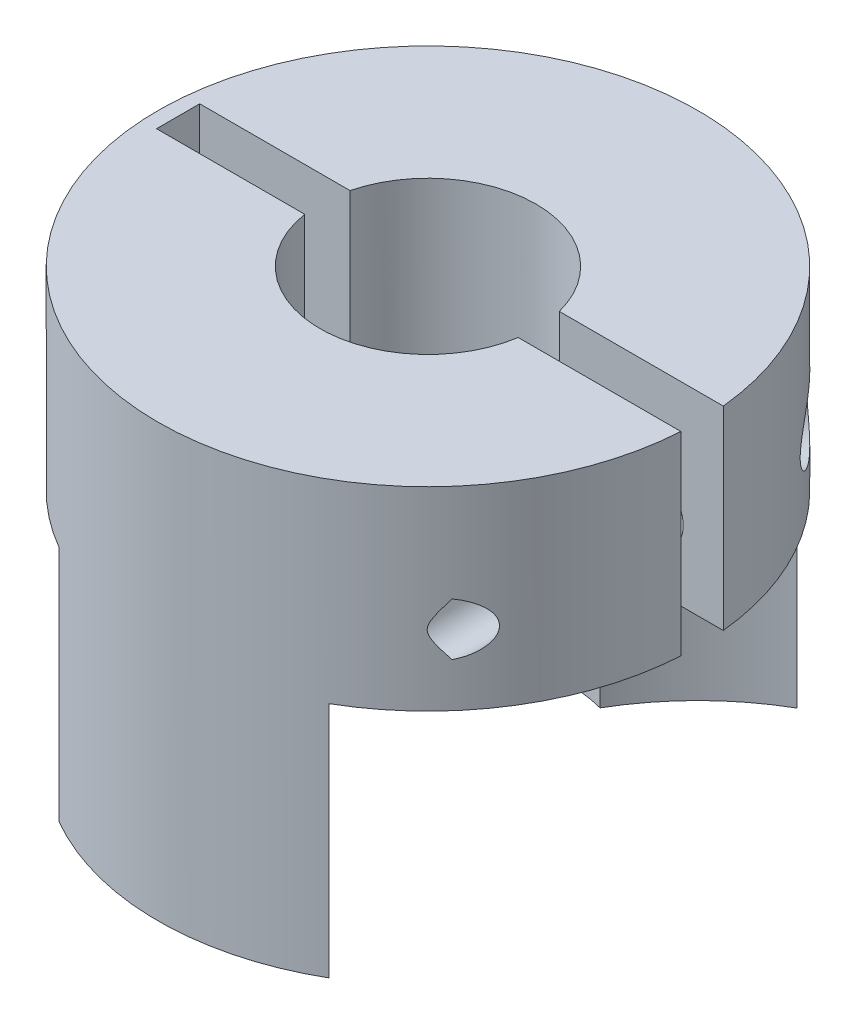
ISO-10303-21;
HEADER;
FILE_DESCRIPTION(('STEP AP214'),'2;1');
FILE_NAME('part.step','',(''),(''),'','','');
FILE_SCHEMA(('AUTOMOTIVE_DESIGN { 1 0 10303 214 1 1 1 1 }'));
ENDSEC;
DATA;
#1=APPLICATION_CONTEXT('core data for automotive mechanical design processes');
#2=APPLICATION_PROTOCOL_DEFINITION('international standard','automotive_design',2000,#1);
#3=PRODUCT_CONTEXT('',#1,'mechanical');
#4=PRODUCT('Part','Part','',(#3));
#5=PRODUCT_RELATED_PRODUCT_CATEGORY('part','',(#4));
#6=PRODUCT_DEFINITION_FORMATION('','',#4);
#7=PRODUCT_DEFINITION_CONTEXT('part definition',#1,'design');
#8=PRODUCT_DEFINITION('design','',#6,#7);
#9=PRODUCT_DEFINITION_SHAPE('','',#8);
#10=(LENGTH_UNIT() NAMED_UNIT(*) SI_UNIT(.MILLI.,.METRE.));
#11=(NAMED_UNIT(*) PLANE_ANGLE_UNIT() SI_UNIT($,.RADIAN.));
#12=(NAMED_UNIT(*) SI_UNIT($,.STERADIAN.) SOLID_ANGLE_UNIT());
#13=UNCERTAINTY_MEASURE_WITH_UNIT(LENGTH_MEASURE(1.E-05),#10,'distance_accuracy_value','');
#14=(GEOMETRIC_REPRESENTATION_CONTEXT(3) GLOBAL_UNCERTAINTY_ASSIGNED_CONTEXT((#13)) GLOBAL_UNIT_ASSIGNED_CONTEXT((#10,
#11,#12)) REPRESENTATION_CONTEXT('',''));
#15=CARTESIAN_POINT('',(0.,0.,0.));
#16=DIRECTION('',(0.,0.,1.));
#17=DIRECTION('',(1.,0.,0.));
#18=AXIS2_PLACEMENT_3D('',#15,#16,#17);
#19=CARTESIAN_POINT('',(9.0873866256993,3.27091239165496,8.26580270830846));
#20=DIRECTION('',(0.,0.,-1.));
#21=DIRECTION('',(-1.,0.,0.));
#22=AXIS2_PLACEMENT_3D('',#19,#20,#21);
#23=CONICAL_SURFACE('',#22,1.25000000001818,1.02974425869486);
#24=CARTESIAN_POINT('',(9.37691343605857,2.05490489736888,8.26580270827864));
#25=CARTESIAN_POINT('',(9.34823636964544,2.10377913839185,8.29833765727385));
#26=CARTESIAN_POINT('',(9.31937379006483,2.15263708601481,8.33073567660937));
#27=CARTESIAN_POINT('',(9.26145900650451,2.25060359496529,8.3950723029447));
#28=CARTESIAN_POINT('',(9.23240668328306,2.29971230857222,8.42701057028863));
#29=CARTESIAN_POINT('',(9.17398462157774,2.39899043619154,8.49057671104065));
#30=CARTESIAN_POINT('',(9.14461528034057,2.44916549976722,8.52219619644441));
#31=CARTESIAN_POINT('',(9.08634435046157,2.55045645984429,8.58429704274558));
#32=CARTESIAN_POINT('',(9.05744259648956,2.60157200951201,8.61477881113187));
#33=CARTESIAN_POINT('',(9.00354761064104,2.70073710212104,8.67107231345171));
#34=CARTESIAN_POINT('',(8.9784419807633,2.74862479685397,8.69705395236432));
#35=CARTESIAN_POINT('',(8.94256452914462,2.82239890995484,8.7338901458976));
#36=CARTESIAN_POINT('',(8.93090353018432,2.84731087232748,8.74581150341275));
#37=CARTESIAN_POINT('',(8.90848505946333,2.89798263721264,8.76864580340958));
#38=CARTESIAN_POINT('',(8.89772721596009,2.92374208475953,8.77955916097537));
#39=CARTESIAN_POINT('',(8.87477187867222,2.98351899911913,8.8027697516426));
#40=CARTESIAN_POINT('',(8.86298277476017,3.01787154664654,8.81463178938376));
#41=CARTESIAN_POINT('',(8.84297662071251,3.0885904327126,8.83470252808923));
#42=CARTESIAN_POINT('',(8.83474366884786,3.12494696915738,8.8429274966196));
#43=CARTESIAN_POINT('',(8.82646544984643,3.17997429994769,8.85118760745881));
#44=CARTESIAN_POINT('',(8.82438832670974,3.19803567567978,8.85325786514942));
#45=CARTESIAN_POINT('',(8.82159655147002,3.23436609213067,8.8560396277983));
#46=CARTESIAN_POINT('',(8.82088162370194,3.25263509008038,8.85675140766933));
#47=CARTESIAN_POINT('',(8.82089059499563,3.30119070653191,8.85674275516931));
#48=CARTESIAN_POINT('',(8.82286746779234,3.33149180944732,8.85477504941482));
#49=CARTESIAN_POINT('',(8.83036615861769,3.39121750209244,8.84729665177245));
#50=CARTESIAN_POINT('',(8.83589671842577,3.42063974260183,8.841777222887));
#51=CARTESIAN_POINT('',(8.84997684207437,3.47974627246575,8.8276844707538));
#52=CARTESIAN_POINT('',(8.85867557033292,3.50935615822802,8.81896003270859));
#53=CARTESIAN_POINT('',(8.87806287003813,3.56723388829251,8.79944254836492));
#54=CARTESIAN_POINT('',(8.88875511147401,3.59549913471964,8.78864568570435));
#55=CARTESIAN_POINT('',(8.91158572947415,3.65127080230195,8.7654953073146));
#56=CARTESIAN_POINT('',(8.92374162950388,3.67876189455889,8.75312279991039));
#57=CARTESIAN_POINT('',(8.94890827634455,3.73283433069144,8.72739164745311));
#58=CARTESIAN_POINT('',(8.96191833341778,3.75941638287051,8.71403379702007));
#59=CARTESIAN_POINT('',(8.99137826196812,3.81760440217316,8.68364300764587));
#60=CARTESIAN_POINT('',(9.00796311503814,3.8490523004461,8.66644045492225));
#61=CARTESIAN_POINT('',(9.04162787703195,3.91127509182417,8.63131272356054));
#62=CARTESIAN_POINT('',(9.05870787571594,3.94204986110761,8.61338741366761));
#63=CARTESIAN_POINT('',(9.11038941308483,4.03374716493374,8.55881467340505));
#64=CARTESIAN_POINT('',(9.14540001417478,4.09398140351941,8.52140386924328));
#65=CARTESIAN_POINT('',(9.21333518724035,4.20983556081705,8.44788756437903));
#66=CARTESIAN_POINT('',(9.24625068273812,4.2655051359255,8.41185056329275));
#67=CARTESIAN_POINT('',(9.31183061237871,4.37641137251642,8.33919771970762));
#68=CARTESIAN_POINT('',(9.34449542356095,4.43164868873858,8.30258321961203));
#69=CARTESIAN_POINT('',(9.37691343606799,4.48691988594578,8.26580270829685));
#70=B_SPLINE_CURVE_WITH_KNOTS('',3,(#24,#25,#26,#27,#28,#29,#30,#31,#32,#33,#34,#35,#36,#37,#38,
#39,#40,#41,#42,#43,#44,#45,#46,#47,#48,#49,#50,#51,#52,#53,#54,#55,#56,#57,#58,#59,#60,#61,#62,
#63,#64,#65,#66,#67,#68,#69),.UNSPECIFIED.,.F.,.F.,(4,2,2,2,2,2,2,2,2,2,2,2,2,2,2,2,2,2,2,2,2,2,
4),(0.,0.19602753707263,0.392193144534779,0.59072440701087,0.78918386679318,0.969036882124861,
1.05894136689586,1.14880866330088,1.26320249647365,1.37707937178137,1.43188093236441,
1.48667140167539,1.5774377040964,1.66842814345155,1.764417363518,1.8605850732717,
1.95804683652526,2.05543084435016,2.1738952739997,2.29238131489985,2.52958422441266,
2.75168786867404,2.97333487639234),.UNSPECIFIED.);
#71=CARTESIAN_POINT('',(9.37691343608817,2.05490489738761,8.26580270827397));
#72=VERTEX_POINT('',#71);
#73=CARTESIAN_POINT('',(9.37691343608786,4.48691988592178,8.26580270827431));
#74=VERTEX_POINT('',#73);
#75=EDGE_CURVE('E23',#72,#74,#70,.T.);
#76=ORIENTED_EDGE('',*,*,#75,.F.);
#77=CARTESIAN_POINT('',(9.0873866256993,3.27091239165496,8.26580270825177));
#78=DIRECTION('',(0.,0.,-1.));
#79=DIRECTION('',(-1.,0.,0.));
#80=AXIS2_PLACEMENT_3D('',#77,#78,#79);
#81=CIRCLE('',#80,1.25);
#82=EDGE_CURVE('E143',#72,#74,#81,.T.);
#83=ORIENTED_EDGE('',*,*,#82,.T.);
#84=EDGE_LOOP('',(#76,#83));
#85=FACE_BOUND('',#84,.T.);
#86=ADVANCED_FACE('F19',(#85),#23,.F.);
#87=CARTESIAN_POINT('',(0.,0.999999999999999,0.));
#88=DIRECTION('',(0.,1.,0.));
#89=DIRECTION('',(0.,0.,1.));
#90=AXIS2_PLACEMENT_3D('',#87,#88,#89);
#91=PLANE('',#90);
#92=DIRECTION('',(1.,0.,0.));
#93=VECTOR('',#92,1.);
#94=CARTESIAN_POINT('',(-11.8043105196322,0.999999999999999,0.765802708251773));
#95=LINE('',#94,#93);
#96=CARTESIAN_POINT('',(-11.8043105196322,0.999999999999999,0.765802708251773));
#97=VERTEX_POINT('',#96);
#98=CARTESIAN_POINT('',(-4.94100659906807,0.999999999999999,0.765802708251773));
#99=VERTEX_POINT('',#98);
#100=EDGE_CURVE('E146',#97,#99,#95,.T.);
#101=ORIENTED_EDGE('',*,*,#100,.T.);
#102=CARTESIAN_POINT('',(0.,0.999999999999999,0.));
#103=DIRECTION('',(0.,-1.,0.));
#104=DIRECTION('',(0.,0.,-1.));
#105=AXIS2_PLACEMENT_3D('',#102,#103,#104);
#106=CIRCLE('',#105,5.);
#107=CARTESIAN_POINT('',(-4.84528193658959,0.999999999999999,-1.23419729174823));
#108=VERTEX_POINT('',#107);
#109=EDGE_CURVE('E362',#99,#108,#106,.T.);
#110=ORIENTED_EDGE('',*,*,#109,.T.);
#111=DIRECTION('',(-1.,0.,0.));
#112=VECTOR('',#111,1.);
#113=CARTESIAN_POINT('',(-3.32475969081981,0.999999999999999,-1.23419729174823));
#114=LINE('',#113,#112);
#115=CARTESIAN_POINT('',(-11.8043105196322,0.999999999999999,-1.23419729174823));
#116=VERTEX_POINT('',#115);
#117=EDGE_CURVE('E241',#108,#116,#114,.T.);
#118=ORIENTED_EDGE('',*,*,#117,.T.);
#119=DIRECTION('',(0.,0.,1.));
#120=VECTOR('',#119,1.);
#121=CARTESIAN_POINT('',(-11.8043105196322,0.999999999999999,-1.23419729174823));
#122=LINE('',#121,#120);
#123=EDGE_CURVE('E232',#116,#97,#122,.T.);
#124=ORIENTED_EDGE('',*,*,#123,.T.);
#125=EDGE_LOOP('',(#101,#110,#118,#124));
#126=FACE_BOUND('',#125,.T.);
#127=ADVANCED_FACE('F218',(#126),#91,.T.);
#128=CARTESIAN_POINT('',(9.0873866256993,3.27091239165496,0.765802708251773));
#129=DIRECTION('',(0.,0.,-1.));
#130=DIRECTION('',(-1.,0.,0.));
#131=AXIS2_PLACEMENT_3D('',#128,#129,#130);
#132=CYLINDRICAL_SURFACE('',#131,1.25);
#133=CARTESIAN_POINT('',(9.0873866256993,3.27091239165496,0.765802708251773));
#134=DIRECTION('',(0.,0.,-1.));
#135=DIRECTION('',(-1.,0.,0.));
#136=AXIS2_PLACEMENT_3D('',#133,#134,#135);
#137=CIRCLE('',#136,1.25);
#138=CARTESIAN_POINT('',(7.8373866256993,3.27091239165496,0.765802708251773));
#139=VERTEX_POINT('',#138);
#140=EDGE_CURVE('E354',#139,#139,#137,.T.);
#141=ORIENTED_EDGE('',*,*,#140,.T.);
#142=EDGE_LOOP('',(#141));
#143=FACE_BOUND('',#142,.T.);
#144=CARTESIAN_POINT('',(9.37691343610224,4.48691988589909,8.265802708258));
#145=CARTESIAN_POINT('',(9.42635211766137,4.47512071704447,8.20972797600935));
#146=CARTESIAN_POINT('',(9.47497923156122,4.46038262060935,8.1535407076429));
#147=CARTESIAN_POINT('',(9.57042977419815,4.42494242517149,8.04128549213383));
#148=CARTESIAN_POINT('',(9.61724884594837,4.40422682872897,7.98521810760817));
#149=CARTESIAN_POINT('',(9.70919960881088,4.35652663614726,7.87316740356659));
#150=CARTESIAN_POINT('',(9.7543057733657,4.32947283321155,7.81719243087551));
#151=CARTESIAN_POINT('',(9.84183287731895,4.26898035623884,7.70670366523164));
#152=CARTESIAN_POINT('',(9.88425681548962,4.23554898671687,7.65218828122307));
#153=CARTESIAN_POINT('',(9.9670636216485,4.16078164336086,7.54403098772386));
#154=CARTESIAN_POINT('',(10.0073602963814,4.11925639531322,7.49045254240309));
#155=CARTESIAN_POINT('',(10.083684943877,4.02815291750281,7.38738000353898));
#156=CARTESIAN_POINT('',(10.1197235480285,3.97859550959755,7.33787583557525));
#157=CARTESIAN_POINT('',(10.1784621073682,3.88282606204299,7.25608955181111));
#158=CARTESIAN_POINT('',(10.2023205996824,3.83848351710648,7.22247011074012));
#159=CARTESIAN_POINT('',(10.2455821366241,3.74395761270726,7.16096736805215));
#160=CARTESIAN_POINT('',(10.2649922832987,3.69378375907839,7.13307493045183));
#161=CARTESIAN_POINT('',(10.2932897849698,3.60244101476354,7.09215256357241));
#162=CARTESIAN_POINT('',(10.3036028579756,3.56260733902115,7.07714527479881));
#163=CARTESIAN_POINT('',(10.3203901095135,3.48053854465573,7.05264290959657));
#164=CARTESIAN_POINT('',(10.3268741502231,3.43830990514017,7.04313367354294));
#165=CARTESIAN_POINT('',(10.333227157052,3.37488587308372,7.03380609880895));
#166=CARTESIAN_POINT('',(10.3347825481541,3.35419382855318,7.03151999048695));
#167=CARTESIAN_POINT('',(10.3368631741153,3.31264241161596,7.02846091769711));
#168=CARTESIAN_POINT('',(10.3373881959266,3.29178300549926,7.0276882661644));
#169=CARTESIAN_POINT('',(10.3373834612683,3.22885248262355,7.02769585710759));
#170=CARTESIAN_POINT('',(10.3352416429691,3.18674705552835,7.03084913282139));
#171=CARTESIAN_POINT('',(10.3268727273246,3.10381253987385,7.04313501285828));
#172=CARTESIAN_POINT('',(10.320637743538,3.06298607495619,7.05227915992845));
#173=CARTESIAN_POINT('',(10.3027386674938,2.97442886047198,7.07840924045334));
#174=CARTESIAN_POINT('',(10.2901537464402,2.92727899631073,7.09671784790626));
#175=CARTESIAN_POINT('',(10.2606964174355,2.83720510109077,7.13924216690707));
#176=CARTESIAN_POINT('',(10.2438168989196,2.79428824376109,7.16346767237377));
#177=CARTESIAN_POINT('',(10.1972048894908,2.69176515500364,7.22975599655687));
#178=CARTESIAN_POINT('',(10.1653291973777,2.63494171793569,7.27458106309522));
#179=CARTESIAN_POINT('',(10.0962539806625,2.53021157642081,7.37015339172015));
#180=CARTESIAN_POINT('',(10.0590401505951,2.48232965422342,7.42091649721168));
#181=CARTESIAN_POINT('',(9.98818383602695,2.40297464708103,7.51591604457926));
#182=CARTESIAN_POINT('',(9.95523140298635,2.37011690945146,7.55952955719941));
#183=CARTESIAN_POINT('',(9.88714518603896,2.30915610007333,7.6483661327337));
#184=CARTESIAN_POINT('',(9.8520099738852,2.28105618724709,7.6935902410651));
#185=CARTESIAN_POINT('',(9.74380555650733,2.20343499031652,7.83082057760833));
#186=CARTESIAN_POINT('',(9.66789616186177,2.16054769618412,7.92444073776088));
#187=CARTESIAN_POINT('',(9.55475796989306,2.11096847021031,8.05974659889356));
#188=CARTESIAN_POINT('',(9.51979073508178,2.09748676243211,8.10102206760082));
#189=CARTESIAN_POINT('',(9.44900316802141,2.07378297086981,8.18347540666459));
#190=CARTESIAN_POINT('',(9.4131868374943,2.0635479813073,8.22465300085292));
#191=CARTESIAN_POINT('',(9.3769134361023,2.05490489741057,8.26580270825795));
#192=B_SPLINE_CURVE_WITH_KNOTS('',3,(#144,#145,#146,#147,#148,#149,#150,#151,#152,#153,#154,
#155,#156,#157,#158,#159,#160,#161,#162,#163,#164,#165,#166,#167,#168,#169,#170,#171,#172,#173,
#174,#175,#176,#177,#178,#179,#180,#181,#182,#183,#184,#185,#186,#187,#188,#189,#190,#191),
.UNSPECIFIED.,.F.,.F.,(4,2,2,2,2,2,2,2,2,2,2,2,2,2,2,2,2,2,2,2,2,2,2,4),(0.,0.227001607773341,
0.454519860268775,0.684648796905926,0.914515722016699,1.15059739845029,1.38607658854649,
1.56718608661381,1.74800438636254,1.87893095048438,2.0095188083324,2.07207559165955,
2.13464530839128,2.26074014266351,2.38707864401641,2.54257209338251,2.69832468792664,
2.93426268186902,3.17084519744942,3.36191791656559,3.55311700371936,3.93526999589727,
4.10245218293676,4.26896123863168),.UNSPECIFIED.);
#193=EDGE_CURVE('E141',#74,#72,#192,.T.);
#194=ORIENTED_EDGE('',*,*,#193,.F.);
#195=ORIENTED_EDGE('',*,*,#82,.F.);
#196=EDGE_LOOP('',(#194,#195));
#197=FACE_BOUND('',#196,.T.);
#198=ADVANCED_FACE('F148',(#143,#197),#132,.F.);
#199=CARTESIAN_POINT('',(-11.8043105196322,0.999999999999999,0.765802708251773));
#200=DIRECTION('',(0.,0.,1.));
#201=DIRECTION('',(1.,0.,0.));
#202=AXIS2_PLACEMENT_3D('',#199,#200,#201);
#203=PLANE('',#202);
#204=ORIENTED_EDGE('',*,*,#100,.F.);
#205=DIRECTION('',(0.,1.,0.));
#206=VECTOR('',#205,1.);
#207=CARTESIAN_POINT('',(-11.8043105196322,0.999999999999999,0.765802708251773));
#208=LINE('',#207,#206);
#209=CARTESIAN_POINT('',(-11.8043105196322,9.,0.765802708251773));
#210=VERTEX_POINT('',#209);
#211=EDGE_CURVE('E224',#97,#210,#208,.T.);
#212=ORIENTED_EDGE('',*,*,#211,.T.);
#213=DIRECTION('',(1.,0.,0.));
#214=VECTOR('',#213,1.);
#215=CARTESIAN_POINT('',(0.,9.,0.765802708251773));
#216=LINE('',#215,#214);
#217=CARTESIAN_POINT('',(-4.94100659906807,9.,0.765802708251773));
#218=VERTEX_POINT('',#217);
#219=EDGE_CURVE('E357',#218,#210,#216,.F.);
#220=ORIENTED_EDGE('',*,*,#219,.F.);
#221=DIRECTION('',(0.,-1.,0.));
#222=VECTOR('',#221,1.);
#223=CARTESIAN_POINT('',(-4.94100659906807,9.,0.765802708251773));
#224=LINE('',#223,#222);
#225=EDGE_CURVE('E227',#218,#99,#224,.T.);
#226=ORIENTED_EDGE('',*,*,#225,.T.);
#227=EDGE_LOOP('',(#204,#212,#220,#226));
#228=FACE_BOUND('',#227,.T.);
#229=ADVANCED_FACE('F211',(#228),#203,.F.);
#230=CARTESIAN_POINT('',(-11.8043105196322,0.999999999999999,-1.23419729174823));
#231=DIRECTION('',(-1.,0.,0.));
#232=DIRECTION('',(0.,0.,1.));
#233=AXIS2_PLACEMENT_3D('',#230,#231,#232);
#234=PLANE('',#233);
#235=ORIENTED_EDGE('',*,*,#211,.F.);
#236=ORIENTED_EDGE('',*,*,#123,.F.);
#237=DIRECTION('',(0.,1.,0.));
#238=VECTOR('',#237,1.);
#239=CARTESIAN_POINT('',(-11.8043105196322,0.999999999999999,-1.23419729174823));
#240=LINE('',#239,#238);
#241=CARTESIAN_POINT('',(-11.8043105196322,9.,-1.23419729174823));
#242=VERTEX_POINT('',#241);
#243=EDGE_CURVE('E246',#116,#242,#240,.T.);
#244=ORIENTED_EDGE('',*,*,#243,.T.);
#245=DIRECTION('',(0.,0.,1.));
#246=VECTOR('',#245,1.);
#247=CARTESIAN_POINT('',(-11.8043105196322,9.,0.));
#248=LINE('',#247,#246);
#249=EDGE_CURVE('E238',#210,#242,#248,.F.);
#250=ORIENTED_EDGE('',*,*,#249,.F.);
#251=EDGE_LOOP('',(#235,#236,#244,#250));
#252=FACE_BOUND('',#251,.T.);
#253=ADVANCED_FACE('F208',(#252),#234,.F.);
#254=CARTESIAN_POINT('',(-3.32475969081981,0.999999999999999,-1.23419729174823));
#255=DIRECTION('',(0.,0.,-1.));
#256=DIRECTION('',(-1.,0.,0.));
#257=AXIS2_PLACEMENT_3D('',#254,#255,#256);
#258=PLANE('',#257);
#259=DIRECTION('',(1.,0.,0.));
#260=VECTOR('',#259,1.);
#261=CARTESIAN_POINT('',(0.,9.,-1.23419729174823));
#262=LINE('',#261,#260);
#263=CARTESIAN_POINT('',(-4.84528193658959,9.,-1.23419729174823));
#264=VERTEX_POINT('',#263);
#265=EDGE_CURVE('E371',#242,#264,#262,.T.);
#266=ORIENTED_EDGE('',*,*,#265,.F.);
#267=ORIENTED_EDGE('',*,*,#243,.F.);
#268=ORIENTED_EDGE('',*,*,#117,.F.);
#269=DIRECTION('',(0.,-1.,0.));
#270=VECTOR('',#269,1.);
#271=CARTESIAN_POINT('',(-4.84528193658959,9.,-1.23419729174823));
#272=LINE('',#271,#270);
#273=EDGE_CURVE('E363',#108,#264,#272,.F.);
#274=ORIENTED_EDGE('',*,*,#273,.T.);
#275=EDGE_LOOP('',(#266,#267,#268,#274));
#276=FACE_BOUND('',#275,.T.);
#277=ADVANCED_FACE('F203',(#276),#258,.F.);
#278=CARTESIAN_POINT('',(9.08341624904097,3.2825117784796,-11.));
#279=DIRECTION('',(0.,0.,1.));
#280=DIRECTION('',(1.,0.,0.));
#281=AXIS2_PLACEMENT_3D('',#278,#279,#280);
#282=CYLINDRICAL_SURFACE('',#281,1.5);
#283=CARTESIAN_POINT('',(9.08341624904097,3.2825117784796,-1.23419729174823));
#284=DIRECTION('',(0.,0.,1.));
#285=DIRECTION('',(1.,0.,0.));
#286=AXIS2_PLACEMENT_3D('',#283,#284,#285);
#287=CIRCLE('',#286,1.5);
#288=CARTESIAN_POINT('',(10.583416249041,3.2825117784796,-1.23419729174823));
#289=VERTEX_POINT('',#288);
#290=EDGE_CURVE('E349',#289,#289,#287,.T.);
#291=ORIENTED_EDGE('',*,*,#290,.T.);
#292=EDGE_LOOP('',(#291));
#293=FACE_BOUND('',#292,.T.);
#294=CARTESIAN_POINT('',(7.58341624904096,3.2825117784796,-9.936890760886));
#295=CARTESIAN_POINT('',(7.5834209983723,3.21143745133633,-9.93688791578893));
#296=CARTESIAN_POINT('',(7.58850330023537,3.14029955579842,-9.933014902131));
#297=CARTESIAN_POINT('',(7.60851615660126,3.00021188265577,-9.91769288383972));
#298=CARTESIAN_POINT('',(7.62346062306707,2.9312653404797,-9.90623317704108));
#299=CARTESIAN_POINT('',(7.66218339506182,2.79784373522121,-9.87631183146526));
#300=CARTESIAN_POINT('',(7.68592572763091,2.73335171505184,-9.85787869948852));
#301=CARTESIAN_POINT('',(7.74093401058121,2.60997250290294,-9.81474183306818));
#302=CARTESIAN_POINT('',(7.77219977970482,2.55108517594063,-9.79003824969398));
#303=CARTESIAN_POINT('',(7.84283812936195,2.43648492336443,-9.73355252599749));
#304=CARTESIAN_POINT('',(7.88258117882353,2.3811665799132,-9.70143779820937));
#305=CARTESIAN_POINT('',(7.96720279283359,2.27826359565636,-9.63206545559696));
#306=CARTESIAN_POINT('',(8.01208410240839,2.23068312183544,-9.59480508959177));
#307=CARTESIAN_POINT('',(8.12803827065346,2.12223910452323,-9.497006711656));
#308=CARTESIAN_POINT('',(8.20131124737801,2.06602186903032,-9.43390328109512));
#309=CARTESIAN_POINT('',(8.35207102013524,1.96981634606421,-9.30070468959651));
#310=CARTESIAN_POINT('',(8.42956687483015,1.92986463990707,-9.23059420563224));
#311=CARTESIAN_POINT('',(8.61254699709539,1.85382196597489,-9.06059550866597));
#312=CARTESIAN_POINT('',(8.71859898789944,1.82364926863922,-8.95868026574796));
#313=CARTESIAN_POINT('',(8.92889036520317,1.78666910321221,-8.74911800772141));
#314=CARTESIAN_POINT('',(9.03312830513469,1.77987950182748,-8.64146667348855));
#315=CARTESIAN_POINT('',(9.23976660787357,1.7870184874968,-8.42022507384299));
#316=CARTESIAN_POINT('',(9.34205954980291,1.80145823446578,-8.30655393851707));
#317=CARTESIAN_POINT('',(9.54047540872224,1.85018755505512,-8.0778860434292));
#318=CARTESIAN_POINT('',(9.63659273291734,1.88449484739089,-7.96288819028606));
#319=CARTESIAN_POINT('',(9.77570791829862,1.95081291897803,-7.79045215428129));
#320=CARTESIAN_POINT('',(9.82159559527422,1.97566541170884,-7.73250250591096));
#321=CARTESIAN_POINT('',(9.91117603914184,2.03048444366458,-7.6173419113347));
#322=CARTESIAN_POINT('',(9.95486961946798,2.06044906923913,-7.56013069729581));
#323=CARTESIAN_POINT('',(10.0397434101869,2.12566332208265,-7.44704924449809));
#324=CARTESIAN_POINT('',(10.0809279785422,2.16090339541066,-7.39117678917208));
#325=CARTESIAN_POINT('',(10.160499810509,2.23708200250361,-7.28140311598012));
#326=CARTESIAN_POINT('',(10.1988891090759,2.27801632637213,-7.22750047862018));
#327=CARTESIAN_POINT('',(10.2728464639377,2.36674099585688,-7.1219957907564));
#328=CARTESIAN_POINT('',(10.3083735914831,2.41461012802127,-7.07043059667324));
#329=CARTESIAN_POINT('',(10.3752137042791,2.51764115621368,-6.97197719565034));
#330=CARTESIAN_POINT('',(10.4065295982458,2.57279796586568,-6.92508576637646));
#331=CARTESIAN_POINT('',(10.4579800922965,2.67970784988213,-6.84707214862437));
#332=CARTESIAN_POINT('',(10.4791041463771,2.73002536512659,-6.81465827642767));
#333=CARTESIAN_POINT('',(10.5165693905218,2.83616966135234,-6.75669732141226));
#334=CARTESIAN_POINT('',(10.532917861344,2.89198788045397,-6.73113979046078));
#335=CARTESIAN_POINT('',(10.5562086130654,2.99450683549837,-6.69453623048669));
#336=CARTESIAN_POINT('',(10.5644664017396,3.04018409691659,-6.68147999515021));
#337=CARTESIAN_POINT('',(10.5767232244352,3.13343201951037,-6.66206155675668));
#338=CARTESIAN_POINT('',(10.5807356205517,3.18099624822828,-6.65567835153824));
#339=CARTESIAN_POINT('',(10.583096672453,3.24666744110013,-6.65192171301857));
#340=CARTESIAN_POINT('',(10.5834182766484,3.26458434394094,-6.65140989160156));
#341=CARTESIAN_POINT('',(10.5834108043814,3.33065165875324,-6.65142289904988));
#342=CARTESIAN_POINT('',(10.5810717677964,3.37886747929252,-6.6551483866685));
#343=CARTESIAN_POINT('',(10.5719341781345,3.47385077021342,-6.66965327841151));
#344=CARTESIAN_POINT('',(10.5651225933671,3.52061358868959,-6.68045329541552));
#345=CARTESIAN_POINT('',(10.5454716120921,3.62267840069705,-6.711440749881));
#346=CARTESIAN_POINT('',(10.5315646893849,3.67726780843524,-6.73327919141995));
#347=CARTESIAN_POINT('',(10.4990305068669,3.78154725415173,-6.78389749969401));
#348=CARTESIAN_POINT('',(10.4803958062068,3.83122939593955,-6.81268830498432));
#349=CARTESIAN_POINT('',(10.427968305902,3.95234013069076,-6.89281158413716));
#350=CARTESIAN_POINT('',(10.3915512295978,4.02024603153238,-6.94770395071204));
#351=CARTESIAN_POINT('',(10.3125010145991,4.14556359017478,-7.0645128933592));
#352=CARTESIAN_POINT('',(10.2698511200115,4.20294598883921,-7.12644830062381));
#353=CARTESIAN_POINT('',(10.1872258702898,4.29983786888201,-7.24394352711663));
#354=CARTESIAN_POINT('',(10.147962656107,4.34073483979892,-7.29887862566727));
#355=CARTESIAN_POINT('',(10.0666082669755,4.41672283226147,-7.41068025291333));
#356=CARTESIAN_POINT('',(10.0245152982286,4.45181012127855,-7.46754799521294));
#357=CARTESIAN_POINT('',(9.93783796932352,4.51656633648426,-7.58251685589977));
#358=CARTESIAN_POINT('',(9.89325194210634,4.54623157907935,-7.6406187830662));
#359=CARTESIAN_POINT('',(9.80185872325339,4.60033528419106,-7.75751798378818));
#360=CARTESIAN_POINT('',(9.75505065783489,4.62477166938419,-7.8163155239441));
#361=CARTESIAN_POINT('',(9.60678033894445,4.69258755496035,-7.99906903391212));
#362=CARTESIAN_POINT('',(9.50183172474101,4.72723970766937,-8.12356024818867));
#363=CARTESIAN_POINT('',(9.28493656782968,4.77303164926719,-8.37060044994946));
#364=CARTESIAN_POINT('',(9.17299600335341,4.78419124882396,-8.49315098732272));
#365=CARTESIAN_POINT('',(8.96070282622876,4.78069355404172,-8.71642523312947));
#366=CARTESIAN_POINT('',(8.86096454891668,4.76948021029307,-8.81777553595151));
#367=CARTESIAN_POINT('',(8.66051704383935,4.72530822948064,-9.01471400014966));
#368=CARTESIAN_POINT('',(8.55980916272754,4.69237638276791,-9.1103091023809));
#369=CARTESIAN_POINT('',(8.38642041004746,4.61324573878577,-9.26974555640308));
#370=CARTESIAN_POINT('',(8.3130594453231,4.57246487844142,-9.33552730945021));
#371=CARTESIAN_POINT('',(8.17062868114745,4.47590824915122,-9.460430391562));
#372=CARTESIAN_POINT('',(8.10155267174113,4.42015483517101,-9.51956146526428));
#373=CARTESIAN_POINT('',(7.98436369888639,4.30591644918387,-9.6179299005839));
#374=CARTESIAN_POINT('',(7.93483830470483,4.25027099312548,-9.65877097335902));
#375=CARTESIAN_POINT('',(7.84289079923566,4.12919048536879,-9.73357969225019));
#376=CARTESIAN_POINT('',(7.80046921861758,4.06375470300365,-9.76754682490819));
#377=CARTESIAN_POINT('',(7.72486934906234,3.9234187624508,-9.82744903653183));
#378=CARTESIAN_POINT('',(7.69178148408154,3.84843559440766,-9.85330579537247));
#379=CARTESIAN_POINT('',(7.63793806830967,3.69167275217619,-9.89510422431719));
#380=CARTESIAN_POINT('',(7.61714927054076,3.6099120883431,-9.91107263024293));
#381=CARTESIAN_POINT('',(7.59676717538482,3.48632662021488,-9.92669063420421));
#382=CARTESIAN_POINT('',(7.59177336815796,3.44582809263831,-9.930508250563));
#383=CARTESIAN_POINT('',(7.58509658081788,3.36439733028368,-9.93560909980598));
#384=CARTESIAN_POINT('',(7.58341351245611,3.32346510709512,-9.93689240024299));
#385=CARTESIAN_POINT('',(7.58341624904096,3.2825117784796,-9.936890760886));
#386=B_SPLINE_CURVE_WITH_KNOTS('',3,(#294,#295,#296,#297,#298,#299,#300,#301,#302,#303,#304,
#305,#306,#307,#308,#309,#310,#311,#312,#313,#314,#315,#316,#317,#318,#319,#320,#321,#322,#323,
#324,#325,#326,#327,#328,#329,#330,#331,#332,#333,#334,#335,#336,#337,#338,#339,#340,#341,#342,
#343,#344,#345,#346,#347,#348,#349,#350,#351,#352,#353,#354,#355,#356,#357,#358,#359,#360,#361,
#362,#363,#364,#365,#366,#367,#368,#369,#370,#371,#372,#373,#374,#375,#376,#377,#378,#379,#380,
#381,#382,#383,#384,#385),.UNSPECIFIED.,.T.,.F.,(4,2,2,2,2,2,2,2,2,2,2,2,2,2,2,2,2,2,2,2,2,2,2,
2,2,2,2,2,2,2,2,2,2,2,2,2,2,2,2,2,2,2,2,2,2,4),(0.,0.2130544743075,0.426410136043908,
0.638902879937481,0.851390504884473,1.07646323317594,1.30165676875022,1.635356685488,
1.96980300468222,2.41782305252272,2.86618535055018,3.32552163760485,3.78526821241258,
4.0190591047744,4.25276267227333,4.48604800667702,4.71916177532404,4.95516878664214,
5.19101194038896,5.38084029179763,5.57037770590489,5.71446325485677,5.85809394254616,
5.91185465621843,6.05621632235796,6.20100049369756,6.38123406762707,6.56175308253496,
6.84400054552353,7.12702123928809,7.36353525376719,7.60020063598683,7.8370262095117,
8.07394569526736,8.57145448698937,9.06854357396416,9.49498073424352,9.9208928543554,
10.2397125566259,10.5580588623553,10.8119383179371,11.0658367303861,11.3221164429486,
11.5777001738261,11.7004663375608,11.8232292288891),.UNSPECIFIED.);
#387=CARTESIAN_POINT('',(7.58341624904096,3.2825117784796,-9.936890760886));
#388=VERTEX_POINT('',#387);
#389=EDGE_CURVE('E185',#388,#388,#386,.T.);
#390=ORIENTED_EDGE('',*,*,#389,.F.);
#391=EDGE_LOOP('',(#390));
#392=FACE_BOUND('',#391,.T.);
#393=ADVANCED_FACE('F197',(#293,#392),#282,.F.);
#394=CARTESIAN_POINT('',(4.12809385323243,0.,0.765802708251773));
#395=DIRECTION('',(0.,0.,1.));
#396=DIRECTION('',(1.,0.,0.));
#397=AXIS2_PLACEMENT_3D('',#394,#395,#396);
#398=PLANE('',#397);
#399=DIRECTION('',(0.,-1.,0.));
#400=VECTOR('',#399,1.);
#401=CARTESIAN_POINT('',(4.94100659906807,9.,0.765802708251773));
#402=LINE('',#401,#400);
#403=CARTESIAN_POINT('',(4.94100659906807,0.,0.765802708251773));
#404=VERTEX_POINT('',#403);
#405=CARTESIAN_POINT('',(4.94100659906807,9.,0.765802708251773));
#406=VERTEX_POINT('',#405);
#407=EDGE_CURVE('E350',#404,#406,#402,.F.);
#408=ORIENTED_EDGE('',*,*,#407,.T.);
#409=DIRECTION('',(1.,0.,0.));
#410=VECTOR('',#409,1.);
#411=CARTESIAN_POINT('',(0.,9.,0.765802708251773));
#412=LINE('',#411,#410);
#413=CARTESIAN_POINT('',(12.4765197956816,9.,0.765802708251773));
#414=VERTEX_POINT('',#413);
#415=EDGE_CURVE('E412',#414,#406,#412,.F.);
#416=ORIENTED_EDGE('',*,*,#415,.F.);
#417=DIRECTION('',(0.,-1.,0.));
#418=VECTOR('',#417,1.);
#419=CARTESIAN_POINT('',(12.4765197956816,9.,0.765802708251774));
#420=LINE('',#419,#418);
#421=CARTESIAN_POINT('',(12.4765197956816,0.,0.765802708251773));
#422=VERTEX_POINT('',#421);
#423=EDGE_CURVE('E158',#422,#414,#420,.F.);
#424=ORIENTED_EDGE('',*,*,#423,.F.);
#425=DIRECTION('',(1.,0.,0.));
#426=VECTOR('',#425,1.);
#427=CARTESIAN_POINT('',(0.,0.,0.765802708251773));
#428=LINE('',#427,#426);
#429=EDGE_CURVE('E301',#422,#404,#428,.F.);
#430=ORIENTED_EDGE('',*,*,#429,.T.);
#431=EDGE_LOOP('',(#408,#416,#424,#430));
#432=FACE_BOUND('',#431,.T.);
#433=ORIENTED_EDGE('',*,*,#140,.F.);
#434=EDGE_LOOP('',(#433));
#435=FACE_BOUND('',#434,.T.);
#436=ADVANCED_FACE('F202',(#432,#435),#398,.F.);
#437=CARTESIAN_POINT('',(0.,9.,0.));
#438=DIRECTION('',(0.,-1.,0.));
#439=DIRECTION('',(0.,0.,-1.));
#440=AXIS2_PLACEMENT_3D('',#437,#438,#439);
#441=CYLINDRICAL_SURFACE('',#440,5.);
#442=CARTESIAN_POINT('',(0.,9.,0.));
#443=DIRECTION('',(0.,-1.,0.));
#444=DIRECTION('',(0.,0.,-1.));
#445=AXIS2_PLACEMENT_3D('',#442,#443,#444);
#446=CIRCLE('',#445,5.);
#447=CARTESIAN_POINT('',(4.84528193658959,9.,-1.23419729174823));
#448=VERTEX_POINT('',#447);
#449=EDGE_CURVE('E171',#264,#448,#446,.T.);
#450=ORIENTED_EDGE('',*,*,#449,.F.);
#451=ORIENTED_EDGE('',*,*,#273,.F.);
#452=ORIENTED_EDGE('',*,*,#109,.F.);
#453=ORIENTED_EDGE('',*,*,#225,.F.);
#454=CARTESIAN_POINT('',(0.,9.,0.));
#455=DIRECTION('',(0.,-1.,0.));
#456=DIRECTION('',(0.,0.,-1.));
#457=AXIS2_PLACEMENT_3D('',#454,#455,#456);
#458=CIRCLE('',#457,5.);
#459=EDGE_CURVE('E196',#406,#218,#458,.T.);
#460=ORIENTED_EDGE('',*,*,#459,.F.);
#461=ORIENTED_EDGE('',*,*,#407,.F.);
#462=CARTESIAN_POINT('',(0.,0.,0.));
#463=DIRECTION('',(0.,-1.,0.));
#464=DIRECTION('',(0.,0.,-1.));
#465=AXIS2_PLACEMENT_3D('',#462,#463,#464);
#466=CIRCLE('',#465,5.);
#467=CARTESIAN_POINT('',(4.84528193658959,0.,-1.23419729174823));
#468=VERTEX_POINT('',#467);
#469=EDGE_CURVE('E298',#404,#468,#466,.T.);
#470=ORIENTED_EDGE('',*,*,#469,.T.);
#471=DIRECTION('',(0.,1.,0.));
#472=VECTOR('',#471,1.);
#473=CARTESIAN_POINT('',(4.84528193658959,0.,-1.23419729174823));
#474=LINE('',#473,#472);
#475=EDGE_CURVE('E346',#468,#448,#474,.T.);
#476=ORIENTED_EDGE('',*,*,#475,.T.);
#477=EDGE_LOOP('',(#450,#451,#452,#453,#460,#461,#470,#476));
#478=FACE_BOUND('',#477,.T.);
#479=ADVANCED_FACE('F426',(#478),#441,.F.);
#480=CARTESIAN_POINT('',(4.12809385323243,0.,-1.23419729174823));
#481=DIRECTION('',(0.,0.,-1.));
#482=DIRECTION('',(-1.,0.,0.));
#483=AXIS2_PLACEMENT_3D('',#480,#481,#482);
#484=PLANE('',#483);
#485=ORIENTED_EDGE('',*,*,#475,.F.);
#486=DIRECTION('',(1.,0.,0.));
#487=VECTOR('',#486,1.);
#488=CARTESIAN_POINT('',(0.,0.,-1.23419729174823));
#489=LINE('',#488,#487);
#490=CARTESIAN_POINT('',(12.4389210563071,0.,-1.23419729174823));
#491=VERTEX_POINT('',#490);
#492=EDGE_CURVE('E297',#468,#491,#489,.T.);
#493=ORIENTED_EDGE('',*,*,#492,.T.);
#494=DIRECTION('',(0.,-1.,0.));
#495=VECTOR('',#494,1.);
#496=CARTESIAN_POINT('',(12.4389210563071,9.,-1.23419729174823));
#497=LINE('',#496,#495);
#498=CARTESIAN_POINT('',(12.4389210563071,9.,-1.23419729174823));
#499=VERTEX_POINT('',#498);
#500=EDGE_CURVE('E340',#499,#491,#497,.T.);
#501=ORIENTED_EDGE('',*,*,#500,.F.);
#502=DIRECTION('',(1.,0.,0.));
#503=VECTOR('',#502,1.);
#504=CARTESIAN_POINT('',(0.,9.,-1.23419729174823));
#505=LINE('',#504,#503);
#506=EDGE_CURVE('E415',#448,#499,#505,.T.);
#507=ORIENTED_EDGE('',*,*,#506,.F.);
#508=EDGE_LOOP('',(#485,#493,#501,#507));
#509=FACE_BOUND('',#508,.T.);
#510=ORIENTED_EDGE('',*,*,#290,.F.);
#511=EDGE_LOOP('',(#510));
#512=FACE_BOUND('',#511,.T.);
#513=ADVANCED_FACE('F440',(#509,#512),#484,.F.);
#514=CARTESIAN_POINT('',(12.5,0.,0.));
#515=DIRECTION('',(0.,-1.,0.));
#516=DIRECTION('',(0.,0.,-1.));
#517=AXIS2_PLACEMENT_3D('',#514,#515,#516);
#518=CYLINDRICAL_SURFACE('',#517,12.5);
#519=CARTESIAN_POINT('',(12.5,-11.,0.));
#520=DIRECTION('',(0.,-1.,0.));
#521=DIRECTION('',(0.,0.,-1.));
#522=AXIS2_PLACEMENT_3D('',#519,#520,#521);
#523=CIRCLE('',#522,12.5);
#524=CARTESIAN_POINT('',(6.25,-11.,-10.8253175473055));
#525=VERTEX_POINT('',#524);
#526=CARTESIAN_POINT('',(1.69,-11.,-6.27645600637812));
#527=VERTEX_POINT('',#526);
#528=EDGE_CURVE('E193',#525,#527,#523,.F.);
#529=ORIENTED_EDGE('',*,*,#528,.F.);
#530=DIRECTION('',(0.,-1.,0.));
#531=VECTOR('',#530,1.);
#532=CARTESIAN_POINT('',(6.25,9.,-10.8253175473055));
#533=LINE('',#532,#531);
#534=CARTESIAN_POINT('',(6.25,0.,-10.8253175473055));
#535=VERTEX_POINT('',#534);
#536=EDGE_CURVE('E194',#535,#525,#533,.T.);
#537=ORIENTED_EDGE('',*,*,#536,.F.);
#538=CARTESIAN_POINT('',(12.5,0.,0.));
#539=DIRECTION('',(0.,-1.,0.));
#540=DIRECTION('',(0.,0.,-1.));
#541=AXIS2_PLACEMENT_3D('',#538,#539,#540);
#542=CIRCLE('',#541,12.5);
#543=CARTESIAN_POINT('',(1.69,0.,-6.27645600637812));
#544=VERTEX_POINT('',#543);
#545=EDGE_CURVE('E290',#535,#544,#542,.F.);
#546=ORIENTED_EDGE('',*,*,#545,.T.);
#547=DIRECTION('',(0.,1.,0.));
#548=VECTOR('',#547,1.);
#549=CARTESIAN_POINT('',(1.69,-11.,-6.27645600637812));
#550=LINE('',#549,#548);
#551=EDGE_CURVE('E332',#544,#527,#550,.F.);
#552=ORIENTED_EDGE('',*,*,#551,.T.);
#553=EDGE_LOOP('',(#529,#537,#546,#552));
#554=FACE_BOUND('',#553,.T.);
#555=ADVANCED_FACE('F330',(#554),#518,.F.);
#556=CARTESIAN_POINT('',(0.,-11.,0.));
#557=DIRECTION('',(0.,1.,0.));
#558=DIRECTION('',(0.,0.,1.));
#559=AXIS2_PLACEMENT_3D('',#556,#557,#558);
#560=CYLINDRICAL_SURFACE('',#559,6.5);
#561=CARTESIAN_POINT('',(0.,0.,0.));
#562=DIRECTION('',(0.,1.,0.));
#563=DIRECTION('',(0.,0.,1.));
#564=AXIS2_PLACEMENT_3D('',#561,#562,#563);
#565=CIRCLE('',#564,6.5);
#566=CARTESIAN_POINT('',(-1.69,0.,-6.27645600637812));
#567=VERTEX_POINT('',#566);
#568=EDGE_CURVE('E286',#544,#567,#565,.T.);
#569=ORIENTED_EDGE('',*,*,#568,.T.);
#570=DIRECTION('',(0.,-1.,0.));
#571=VECTOR('',#570,1.);
#572=CARTESIAN_POINT('',(-1.69,0.,-6.27645600637812));
#573=LINE('',#572,#571);
#574=CARTESIAN_POINT('',(-1.69,-11.,-6.27645600637812));
#575=VERTEX_POINT('',#574);
#576=EDGE_CURVE('E315',#567,#575,#573,.T.);
#577=ORIENTED_EDGE('',*,*,#576,.T.);
#578=CARTESIAN_POINT('',(0.,-11.,0.));
#579=DIRECTION('',(0.,1.,0.));
#580=DIRECTION('',(0.,0.,1.));
#581=AXIS2_PLACEMENT_3D('',#578,#579,#580);
#582=CIRCLE('',#581,6.5);
#583=EDGE_CURVE('E317',#527,#575,#582,.T.);
#584=ORIENTED_EDGE('',*,*,#583,.F.);
#585=ORIENTED_EDGE('',*,*,#551,.F.);
#586=EDGE_LOOP('',(#569,#577,#584,#585));
#587=FACE_BOUND('',#586,.T.);
#588=ADVANCED_FACE('F446',(#587),#560,.F.);
#589=CARTESIAN_POINT('',(0.,-11.,0.));
#590=DIRECTION('',(0.,1.,0.));
#591=DIRECTION('',(0.,0.,1.));
#592=AXIS2_PLACEMENT_3D('',#589,#590,#591);
#593=CYLINDRICAL_SURFACE('',#592,6.5);
#594=CARTESIAN_POINT('',(0.,-11.,0.));
#595=DIRECTION('',(0.,1.,0.));
#596=DIRECTION('',(0.,0.,1.));
#597=AXIS2_PLACEMENT_3D('',#594,#595,#596);
#598=CIRCLE('',#597,6.5);
#599=CARTESIAN_POINT('',(-1.69,-11.,6.27645600637812));
#600=VERTEX_POINT('',#599);
#601=CARTESIAN_POINT('',(1.69,-11.,6.27645600637813));
#602=VERTEX_POINT('',#601);
#603=EDGE_CURVE('E162',#600,#602,#598,.T.);
#604=ORIENTED_EDGE('',*,*,#603,.F.);
#605=DIRECTION('',(0.,-1.,0.));
#606=VECTOR('',#605,1.);
#607=CARTESIAN_POINT('',(-1.69,0.,6.27645600637812));
#608=LINE('',#607,#606);
#609=CARTESIAN_POINT('',(-1.69,0.,6.27645600637812));
#610=VERTEX_POINT('',#609);
#611=EDGE_CURVE('E282',#600,#610,#608,.F.);
#612=ORIENTED_EDGE('',*,*,#611,.T.);
#613=CARTESIAN_POINT('',(0.,0.,0.));
#614=DIRECTION('',(0.,1.,0.));
#615=DIRECTION('',(0.,0.,1.));
#616=AXIS2_PLACEMENT_3D('',#613,#614,#615);
#617=CIRCLE('',#616,6.5);
#618=CARTESIAN_POINT('',(1.69,0.,6.27645600637813));
#619=VERTEX_POINT('',#618);
#620=EDGE_CURVE('E309',#610,#619,#617,.T.);
#621=ORIENTED_EDGE('',*,*,#620,.T.);
#622=DIRECTION('',(0.,-1.,0.));
#623=VECTOR('',#622,1.);
#624=CARTESIAN_POINT('',(1.69,0.,6.27645600637813));
#625=LINE('',#624,#623);
#626=EDGE_CURVE('E151',#619,#602,#625,.T.);
#627=ORIENTED_EDGE('',*,*,#626,.T.);
#628=EDGE_LOOP('',(#604,#612,#621,#627));
#629=FACE_BOUND('',#628,.T.);
#630=ADVANCED_FACE('F394',(#629),#593,.F.);
#631=CARTESIAN_POINT('',(12.5,0.,0.));
#632=DIRECTION('',(0.,-1.,0.));
#633=DIRECTION('',(0.,0.,-1.));
#634=AXIS2_PLACEMENT_3D('',#631,#632,#633);
#635=CYLINDRICAL_SURFACE('',#634,12.5);
#636=CARTESIAN_POINT('',(12.5,0.,0.));
#637=DIRECTION('',(0.,-1.,0.));
#638=DIRECTION('',(0.,0.,-1.));
#639=AXIS2_PLACEMENT_3D('',#636,#637,#638);
#640=CIRCLE('',#639,12.5);
#641=CARTESIAN_POINT('',(6.25,0.,10.8253175473055));
#642=VERTEX_POINT('',#641);
#643=EDGE_CURVE('E306',#619,#642,#640,.F.);
#644=ORIENTED_EDGE('',*,*,#643,.T.);
#645=DIRECTION('',(0.,-1.,0.));
#646=VECTOR('',#645,1.);
#647=CARTESIAN_POINT('',(6.25,9.,10.8253175473055));
#648=LINE('',#647,#646);
#649=CARTESIAN_POINT('',(6.25,-11.,10.8253175473055));
#650=VERTEX_POINT('',#649);
#651=EDGE_CURVE('E150',#650,#642,#648,.F.);
#652=ORIENTED_EDGE('',*,*,#651,.F.);
#653=CARTESIAN_POINT('',(12.5,-11.,0.));
#654=DIRECTION('',(0.,-1.,0.));
#655=DIRECTION('',(0.,0.,-1.));
#656=AXIS2_PLACEMENT_3D('',#653,#654,#655);
#657=CIRCLE('',#656,12.5);
#658=EDGE_CURVE('E278',#602,#650,#657,.F.);
#659=ORIENTED_EDGE('',*,*,#658,.F.);
#660=ORIENTED_EDGE('',*,*,#626,.F.);
#661=EDGE_LOOP('',(#644,#652,#659,#660));
#662=FACE_BOUND('',#661,.T.);
#663=ADVANCED_FACE('F398',(#662),#635,.F.);
#664=CARTESIAN_POINT('',(0.,9.,0.));
#665=DIRECTION('',(0.,1.,0.));
#666=DIRECTION('',(0.,0.,1.));
#667=AXIS2_PLACEMENT_3D('',#664,#665,#666);
#668=PLANE('',#667);
#669=ORIENTED_EDGE('',*,*,#415,.T.);
#670=ORIENTED_EDGE('',*,*,#459,.T.);
#671=ORIENTED_EDGE('',*,*,#219,.T.);
#672=ORIENTED_EDGE('',*,*,#249,.T.);
#673=ORIENTED_EDGE('',*,*,#265,.T.);
#674=ORIENTED_EDGE('',*,*,#449,.T.);
#675=ORIENTED_EDGE('',*,*,#506,.T.);
#676=CARTESIAN_POINT('',(0.,9.,0.));
#677=DIRECTION('',(0.,-1.,0.));
#678=DIRECTION('',(0.,0.,-1.));
#679=AXIS2_PLACEMENT_3D('',#676,#677,#678);
#680=CIRCLE('',#679,12.5);
#681=EDGE_CURVE('E273',#414,#499,#680,.T.);
#682=ORIENTED_EDGE('',*,*,#681,.F.);
#683=EDGE_LOOP('',(#669,#670,#671,#672,#673,#674,#675,#682));
#684=FACE_BOUND('',#683,.T.);
#685=ADVANCED_FACE('F422',(#684),#668,.T.);
#686=CARTESIAN_POINT('',(0.,-11.,0.));
#687=DIRECTION('',(0.,-1.,0.));
#688=DIRECTION('',(0.,0.,-1.));
#689=AXIS2_PLACEMENT_3D('',#686,#687,#688);
#690=PLANE('',#689);
#691=CARTESIAN_POINT('',(0.,-11.,0.));
#692=DIRECTION('',(0.,-1.,0.));
#693=DIRECTION('',(0.,0.,-1.));
#694=AXIS2_PLACEMENT_3D('',#691,#692,#693);
#695=CIRCLE('',#694,12.5);
#696=CARTESIAN_POINT('',(-6.25,-11.,-10.8253175473055));
#697=VERTEX_POINT('',#696);
#698=EDGE_CURVE('E269',#525,#697,#695,.F.);
#699=ORIENTED_EDGE('',*,*,#698,.F.);
#700=ORIENTED_EDGE('',*,*,#528,.T.);
#701=ORIENTED_EDGE('',*,*,#583,.T.);
#702=CARTESIAN_POINT('',(-12.5,-11.,0.));
#703=DIRECTION('',(0.,-1.,0.));
#704=DIRECTION('',(0.,0.,-1.));
#705=AXIS2_PLACEMENT_3D('',#702,#703,#704);
#706=CIRCLE('',#705,12.5);
#707=EDGE_CURVE('E316',#575,#697,#706,.F.);
#708=ORIENTED_EDGE('',*,*,#707,.T.);
#709=EDGE_LOOP('',(#699,#700,#701,#708));
#710=FACE_BOUND('',#709,.T.);
#711=ADVANCED_FACE('F327',(#710),#690,.T.);
#712=CARTESIAN_POINT('',(-12.5,0.,0.));
#713=DIRECTION('',(0.,-1.,0.));
#714=DIRECTION('',(0.,0.,-1.));
#715=AXIS2_PLACEMENT_3D('',#712,#713,#714);
#716=CYLINDRICAL_SURFACE('',#715,12.5);
#717=CARTESIAN_POINT('',(-12.5,0.,0.));
#718=DIRECTION('',(0.,-1.,0.));
#719=DIRECTION('',(0.,0.,-1.));
#720=AXIS2_PLACEMENT_3D('',#717,#718,#719);
#721=CIRCLE('',#720,12.5);
#722=CARTESIAN_POINT('',(-6.25,0.,-10.8253175473055));
#723=VERTEX_POINT('',#722);
#724=EDGE_CURVE('E312',#567,#723,#721,.F.);
#725=ORIENTED_EDGE('',*,*,#724,.T.);
#726=DIRECTION('',(0.,-1.,0.));
#727=VECTOR('',#726,1.);
#728=CARTESIAN_POINT('',(-6.25,9.,-10.8253175473055));
#729=LINE('',#728,#727);
#730=EDGE_CURVE('E268',#697,#723,#729,.F.);
#731=ORIENTED_EDGE('',*,*,#730,.F.);
#732=ORIENTED_EDGE('',*,*,#707,.F.);
#733=ORIENTED_EDGE('',*,*,#576,.F.);
#734=EDGE_LOOP('',(#725,#731,#732,#733));
#735=FACE_BOUND('',#734,.T.);
#736=ADVANCED_FACE('F450',(#735),#716,.F.);
#737=CARTESIAN_POINT('',(0.,0.,0.));
#738=DIRECTION('',(0.,1.,0.));
#739=DIRECTION('',(0.,0.,1.));
#740=AXIS2_PLACEMENT_3D('',#737,#738,#739);
#741=PLANE('',#740);
#742=ORIENTED_EDGE('',*,*,#545,.F.);
#743=CARTESIAN_POINT('',(0.,0.,0.));
#744=DIRECTION('',(0.,-1.,0.));
#745=DIRECTION('',(0.,0.,-1.));
#746=AXIS2_PLACEMENT_3D('',#743,#744,#745);
#747=CIRCLE('',#746,12.5);
#748=EDGE_CURVE('E293',#491,#535,#747,.F.);
#749=ORIENTED_EDGE('',*,*,#748,.F.);
#750=ORIENTED_EDGE('',*,*,#492,.F.);
#751=ORIENTED_EDGE('',*,*,#469,.F.);
#752=ORIENTED_EDGE('',*,*,#429,.F.);
#753=CARTESIAN_POINT('',(0.,0.,0.));
#754=DIRECTION('',(0.,-1.,0.));
#755=DIRECTION('',(0.,0.,-1.));
#756=AXIS2_PLACEMENT_3D('',#753,#754,#755);
#757=CIRCLE('',#756,12.5);
#758=EDGE_CURVE('E302',#642,#422,#757,.F.);
#759=ORIENTED_EDGE('',*,*,#758,.F.);
#760=ORIENTED_EDGE('',*,*,#643,.F.);
#761=ORIENTED_EDGE('',*,*,#620,.F.);
#762=CARTESIAN_POINT('',(-12.5,0.,0.));
#763=DIRECTION('',(0.,-1.,0.));
#764=DIRECTION('',(0.,0.,-1.));
#765=AXIS2_PLACEMENT_3D('',#762,#763,#764);
#766=CIRCLE('',#765,12.5);
#767=CARTESIAN_POINT('',(-6.25,0.,10.8253175473055));
#768=VERTEX_POINT('',#767);
#769=EDGE_CURVE('E283',#610,#768,#766,.T.);
#770=ORIENTED_EDGE('',*,*,#769,.T.);
#771=CARTESIAN_POINT('',(0.,0.,0.));
#772=DIRECTION('',(0.,-1.,0.));
#773=DIRECTION('',(0.,0.,-1.));
#774=AXIS2_PLACEMENT_3D('',#771,#772,#773);
#775=CIRCLE('',#774,12.5);
#776=EDGE_CURVE('E264',#723,#768,#775,.F.);
#777=ORIENTED_EDGE('',*,*,#776,.F.);
#778=ORIENTED_EDGE('',*,*,#724,.F.);
#779=ORIENTED_EDGE('',*,*,#568,.F.);
#780=EDGE_LOOP('',(#742,#749,#750,#751,#752,#759,#760,#761,#770,#777,#778,#779));
#781=FACE_BOUND('',#780,.T.);
#782=ADVANCED_FACE('F402',(#781),#741,.F.);
#783=CARTESIAN_POINT('',(-12.5,0.,0.));
#784=DIRECTION('',(0.,-1.,0.));
#785=DIRECTION('',(0.,0.,-1.));
#786=AXIS2_PLACEMENT_3D('',#783,#784,#785);
#787=CYLINDRICAL_SURFACE('',#786,12.5);
#788=CARTESIAN_POINT('',(-12.5,-11.,0.));
#789=DIRECTION('',(0.,-1.,0.));
#790=DIRECTION('',(0.,0.,-1.));
#791=AXIS2_PLACEMENT_3D('',#788,#789,#790);
#792=CIRCLE('',#791,12.5);
#793=CARTESIAN_POINT('',(-6.25,-11.,10.8253175473055));
#794=VERTEX_POINT('',#793);
#795=EDGE_CURVE('E44',#794,#600,#792,.F.);
#796=ORIENTED_EDGE('',*,*,#795,.F.);
#797=DIRECTION('',(0.,-1.,0.));
#798=VECTOR('',#797,1.);
#799=CARTESIAN_POINT('',(-6.25,9.,10.8253175473055));
#800=LINE('',#799,#798);
#801=EDGE_CURVE('E35',#768,#794,#800,.T.);
#802=ORIENTED_EDGE('',*,*,#801,.F.);
#803=ORIENTED_EDGE('',*,*,#769,.F.);
#804=ORIENTED_EDGE('',*,*,#611,.F.);
#805=EDGE_LOOP('',(#796,#802,#803,#804));
#806=FACE_BOUND('',#805,.T.);
#807=ADVANCED_FACE('F453',(#806),#787,.F.);
#808=CARTESIAN_POINT('',(0.,-11.,0.));
#809=DIRECTION('',(0.,-1.,0.));
#810=DIRECTION('',(0.,0.,-1.));
#811=AXIS2_PLACEMENT_3D('',#808,#809,#810);
#812=PLANE('',#811);
#813=ORIENTED_EDGE('',*,*,#603,.T.);
#814=ORIENTED_EDGE('',*,*,#658,.T.);
#815=CARTESIAN_POINT('',(0.,-11.,0.));
#816=DIRECTION('',(0.,-1.,0.));
#817=DIRECTION('',(0.,0.,-1.));
#818=AXIS2_PLACEMENT_3D('',#815,#816,#817);
#819=CIRCLE('',#818,12.5);
#820=EDGE_CURVE('E11',#794,#650,#819,.F.);
#821=ORIENTED_EDGE('',*,*,#820,.F.);
#822=ORIENTED_EDGE('',*,*,#795,.T.);
#823=EDGE_LOOP('',(#813,#814,#821,#822));
#824=FACE_BOUND('',#823,.T.);
#825=ADVANCED_FACE('F179',(#824),#812,.T.);
#826=CARTESIAN_POINT('',(0.,9.,0.));
#827=DIRECTION('',(0.,-1.,0.));
#828=DIRECTION('',(0.,0.,-1.));
#829=AXIS2_PLACEMENT_3D('',#826,#827,#828);
#830=CYLINDRICAL_SURFACE('',#829,12.5);
#831=ORIENTED_EDGE('',*,*,#801,.T.);
#832=ORIENTED_EDGE('',*,*,#820,.T.);
#833=ORIENTED_EDGE('',*,*,#651,.T.);
#834=ORIENTED_EDGE('',*,*,#758,.T.);
#835=ORIENTED_EDGE('',*,*,#423,.T.);
#836=ORIENTED_EDGE('',*,*,#681,.T.);
#837=ORIENTED_EDGE('',*,*,#500,.T.);
#838=ORIENTED_EDGE('',*,*,#748,.T.);
#839=ORIENTED_EDGE('',*,*,#536,.T.);
#840=ORIENTED_EDGE('',*,*,#698,.T.);
#841=ORIENTED_EDGE('',*,*,#730,.T.);
#842=ORIENTED_EDGE('',*,*,#776,.T.);
#843=EDGE_LOOP('',(#831,#832,#833,#834,#835,#836,#837,#838,#839,#840,#841,#842));
#844=FACE_BOUND('',#843,.T.);
#845=ORIENTED_EDGE('',*,*,#389,.T.);
#846=EDGE_LOOP('',(#845));
#847=FACE_BOUND('',#846,.T.);
#848=ORIENTED_EDGE('',*,*,#75,.T.);
#849=ORIENTED_EDGE('',*,*,#193,.T.);
#850=EDGE_LOOP('',(#848,#849));
#851=FACE_BOUND('',#850,.T.);
#852=ADVANCED_FACE('F139',(#844,#847,#851),#830,.T.);
#853=CLOSED_SHELL('',(#86,#127,#198,#229,#253,#277,#393,#436,#479,#513,#555,#588,#630,#663,#685,
#711,#736,#782,#807,#825,#852));
#854=MANIFOLD_SOLID_BREP('B1',#853);
#855=ADVANCED_BREP_SHAPE_REPRESENTATION('',(#18,#854),#14);
#856=SHAPE_DEFINITION_REPRESENTATION(#9,#855);
ENDSEC;
END-ISO-10303-21;
